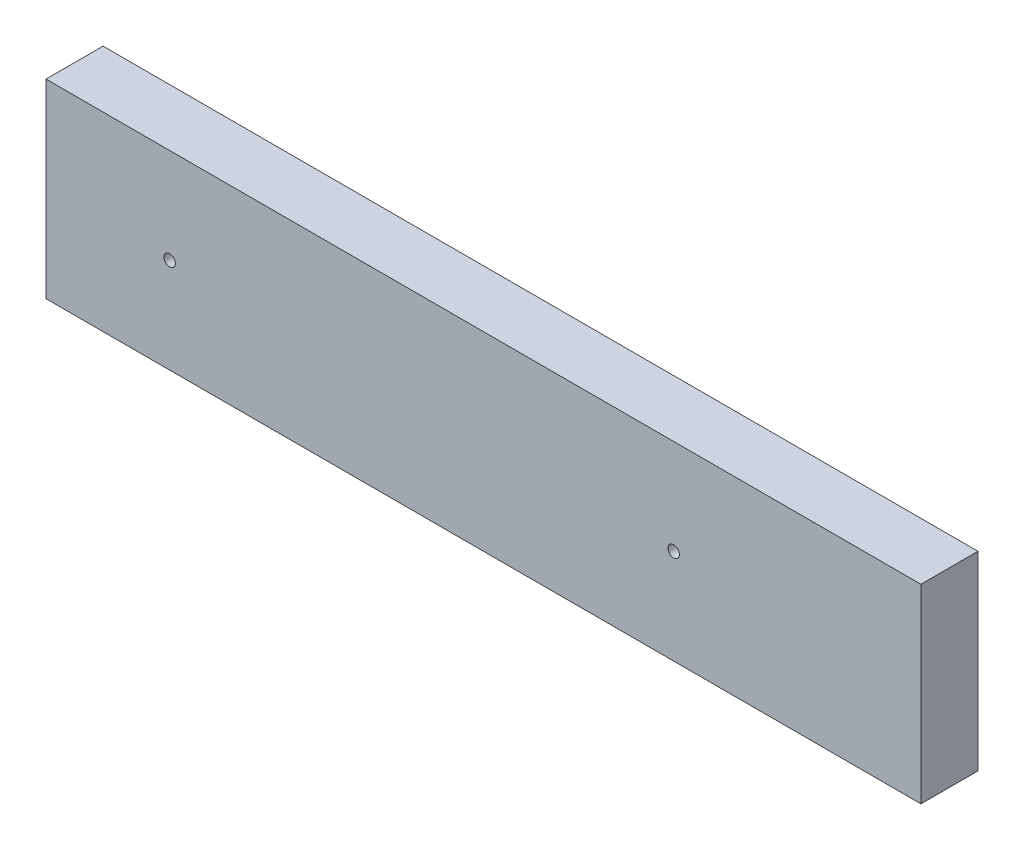
ISO-10303-21;
HEADER;
FILE_DESCRIPTION(('STEP AP214'),'2;1');
FILE_NAME('part.step','',(''),(''),'','','');
FILE_SCHEMA(('AUTOMOTIVE_DESIGN { 1 0 10303 214 1 1 1 1 }'));
ENDSEC;
DATA;
#1=APPLICATION_CONTEXT('core data for automotive mechanical design processes');
#2=APPLICATION_PROTOCOL_DEFINITION('international standard','automotive_design',2000,#1);
#3=PRODUCT_CONTEXT('',#1,'mechanical');
#4=PRODUCT('Part','Part','',(#3));
#5=PRODUCT_RELATED_PRODUCT_CATEGORY('part','',(#4));
#6=PRODUCT_DEFINITION_FORMATION('','',#4);
#7=PRODUCT_DEFINITION_CONTEXT('part definition',#1,'design');
#8=PRODUCT_DEFINITION('design','',#6,#7);
#9=PRODUCT_DEFINITION_SHAPE('','',#8);
#10=(LENGTH_UNIT() NAMED_UNIT(*) SI_UNIT(.MILLI.,.METRE.));
#11=(NAMED_UNIT(*) PLANE_ANGLE_UNIT() SI_UNIT($,.RADIAN.));
#12=(NAMED_UNIT(*) SI_UNIT($,.STERADIAN.) SOLID_ANGLE_UNIT());
#13=UNCERTAINTY_MEASURE_WITH_UNIT(LENGTH_MEASURE(1.E-05),#10,'distance_accuracy_value','');
#14=(GEOMETRIC_REPRESENTATION_CONTEXT(3) GLOBAL_UNCERTAINTY_ASSIGNED_CONTEXT((#13)) GLOBAL_UNIT_ASSIGNED_CONTEXT((#10,
#11,#12)) REPRESENTATION_CONTEXT('',''));
#15=CARTESIAN_POINT('',(0.,0.,0.));
#16=DIRECTION('',(0.,0.,1.));
#17=DIRECTION('',(1.,0.,0.));
#18=AXIS2_PLACEMENT_3D('',#15,#16,#17);
#19=CARTESIAN_POINT('',(230.,50.,30.));
#20=DIRECTION('',(-1.,0.,0.));
#21=DIRECTION('',(0.,0.,1.));
#22=AXIS2_PLACEMENT_3D('',#19,#20,#21);
#23=PLANE('',#22);
#24=DIRECTION('',(0.,1.,0.));
#25=VECTOR('',#24,1.);
#26=CARTESIAN_POINT('',(230.,50.,0.));
#27=LINE('',#26,#25);
#28=CARTESIAN_POINT('',(230.,-50.,0.));
#29=VERTEX_POINT('',#28);
#30=CARTESIAN_POINT('',(230.,50.,0.));
#31=VERTEX_POINT('',#30);
#32=EDGE_CURVE('E107',#29,#31,#27,.T.);
#33=ORIENTED_EDGE('',*,*,#32,.T.);
#34=DIRECTION('',(0.,0.,-1.));
#35=VECTOR('',#34,1.);
#36=CARTESIAN_POINT('',(230.,50.,30.));
#37=LINE('',#36,#35);
#38=CARTESIAN_POINT('',(230.,50.,30.));
#39=VERTEX_POINT('',#38);
#40=EDGE_CURVE('E11',#39,#31,#37,.T.);
#41=ORIENTED_EDGE('',*,*,#40,.F.);
#42=DIRECTION('',(0.,1.,0.));
#43=VECTOR('',#42,1.);
#44=CARTESIAN_POINT('',(230.,50.,30.));
#45=LINE('',#44,#43);
#46=CARTESIAN_POINT('',(230.,-50.,30.));
#47=VERTEX_POINT('',#46);
#48=EDGE_CURVE('E91',#47,#39,#45,.T.);
#49=ORIENTED_EDGE('',*,*,#48,.F.);
#50=DIRECTION('',(0.,0.,-1.));
#51=VECTOR('',#50,1.);
#52=CARTESIAN_POINT('',(230.,-50.,30.));
#53=LINE('',#52,#51);
#54=EDGE_CURVE('E103',#47,#29,#53,.T.);
#55=ORIENTED_EDGE('',*,*,#54,.T.);
#56=EDGE_LOOP('',(#33,#41,#49,#55));
#57=FACE_BOUND('',#56,.T.);
#58=ADVANCED_FACE('F39',(#57),#23,.F.);
#59=CARTESIAN_POINT('',(-230.,50.,30.));
#60=DIRECTION('',(0.,-1.,0.));
#61=DIRECTION('',(0.,0.,-1.));
#62=AXIS2_PLACEMENT_3D('',#59,#60,#61);
#63=PLANE('',#62);
#64=DIRECTION('',(-1.,0.,0.));
#65=VECTOR('',#64,1.);
#66=CARTESIAN_POINT('',(-230.,50.,0.));
#67=LINE('',#66,#65);
#68=CARTESIAN_POINT('',(-230.,50.,0.));
#69=VERTEX_POINT('',#68);
#70=EDGE_CURVE('E96',#31,#69,#67,.T.);
#71=ORIENTED_EDGE('',*,*,#70,.T.);
#72=DIRECTION('',(0.,0.,-1.));
#73=VECTOR('',#72,1.);
#74=CARTESIAN_POINT('',(-230.,50.,30.));
#75=LINE('',#74,#73);
#76=CARTESIAN_POINT('',(-230.,50.,30.));
#77=VERTEX_POINT('',#76);
#78=EDGE_CURVE('E48',#77,#69,#75,.T.);
#79=ORIENTED_EDGE('',*,*,#78,.F.);
#80=DIRECTION('',(-1.,0.,0.));
#81=VECTOR('',#80,1.);
#82=CARTESIAN_POINT('',(-230.,50.,30.));
#83=LINE('',#82,#81);
#84=EDGE_CURVE('E86',#39,#77,#83,.T.);
#85=ORIENTED_EDGE('',*,*,#84,.F.);
#86=ORIENTED_EDGE('',*,*,#40,.T.);
#87=EDGE_LOOP('',(#71,#79,#85,#86));
#88=FACE_BOUND('',#87,.T.);
#89=ADVANCED_FACE('F95',(#88),#63,.F.);
#90=CARTESIAN_POINT('',(-230.,50.,30.));
#91=DIRECTION('',(1.,0.,0.));
#92=DIRECTION('',(0.,0.,-1.));
#93=AXIS2_PLACEMENT_3D('',#90,#91,#92);
#94=PLANE('',#93);
#95=DIRECTION('',(0.,-1.,0.));
#96=VECTOR('',#95,1.);
#97=CARTESIAN_POINT('',(-230.,50.,0.));
#98=LINE('',#97,#96);
#99=CARTESIAN_POINT('',(-230.,-50.,0.));
#100=VERTEX_POINT('',#99);
#101=EDGE_CURVE('E73',#69,#100,#98,.T.);
#102=ORIENTED_EDGE('',*,*,#101,.T.);
#103=DIRECTION('',(0.,0.,-1.));
#104=VECTOR('',#103,1.);
#105=CARTESIAN_POINT('',(-230.,-50.,30.));
#106=LINE('',#105,#104);
#107=CARTESIAN_POINT('',(-230.,-50.,30.));
#108=VERTEX_POINT('',#107);
#109=EDGE_CURVE('E98',#108,#100,#106,.T.);
#110=ORIENTED_EDGE('',*,*,#109,.F.);
#111=DIRECTION('',(0.,-1.,0.));
#112=VECTOR('',#111,1.);
#113=CARTESIAN_POINT('',(-230.,50.,30.));
#114=LINE('',#113,#112);
#115=EDGE_CURVE('E89',#77,#108,#114,.T.);
#116=ORIENTED_EDGE('',*,*,#115,.F.);
#117=ORIENTED_EDGE('',*,*,#78,.T.);
#118=EDGE_LOOP('',(#102,#110,#116,#117));
#119=FACE_BOUND('',#118,.T.);
#120=ADVANCED_FACE('F99',(#119),#94,.F.);
#121=CARTESIAN_POINT('',(-230.,-50.,30.));
#122=DIRECTION('',(0.,1.,0.));
#123=DIRECTION('',(0.,0.,1.));
#124=AXIS2_PLACEMENT_3D('',#121,#122,#123);
#125=PLANE('',#124);
#126=DIRECTION('',(1.,0.,0.));
#127=VECTOR('',#126,1.);
#128=CARTESIAN_POINT('',(-230.,-50.,0.));
#129=LINE('',#128,#127);
#130=EDGE_CURVE('E79',#100,#29,#129,.T.);
#131=ORIENTED_EDGE('',*,*,#130,.T.);
#132=ORIENTED_EDGE('',*,*,#54,.F.);
#133=DIRECTION('',(1.,0.,0.));
#134=VECTOR('',#133,1.);
#135=CARTESIAN_POINT('',(-230.,-50.,30.));
#136=LINE('',#135,#134);
#137=EDGE_CURVE('E56',#108,#47,#136,.T.);
#138=ORIENTED_EDGE('',*,*,#137,.F.);
#139=ORIENTED_EDGE('',*,*,#109,.T.);
#140=EDGE_LOOP('',(#131,#132,#138,#139));
#141=FACE_BOUND('',#140,.T.);
#142=ADVANCED_FACE('F121',(#141),#125,.F.);
#143=CARTESIAN_POINT('',(0.,0.,30.));
#144=DIRECTION('',(0.,0.,1.));
#145=DIRECTION('',(1.,0.,0.));
#146=AXIS2_PLACEMENT_3D('',#143,#144,#145);
#147=PLANE('',#146);
#148=CARTESIAN_POINT('',(100.,0.,30.));
#149=DIRECTION('',(0.,0.,1.));
#150=DIRECTION('',(1.,0.,0.));
#151=AXIS2_PLACEMENT_3D('',#148,#149,#150);
#152=CIRCLE('',#151,3.00000000000001);
#153=CARTESIAN_POINT('',(103.,0.,30.));
#154=VERTEX_POINT('',#153);
#155=EDGE_CURVE('E111',#154,#154,#152,.T.);
#156=ORIENTED_EDGE('',*,*,#155,.F.);
#157=EDGE_LOOP('',(#156));
#158=FACE_BOUND('',#157,.T.);
#159=CARTESIAN_POINT('',(-165.,0.,30.));
#160=DIRECTION('',(0.,0.,1.));
#161=DIRECTION('',(1.,0.,0.));
#162=AXIS2_PLACEMENT_3D('',#159,#160,#161);
#163=CIRCLE('',#162,2.99999999999999);
#164=CARTESIAN_POINT('',(-162.,0.,30.));
#165=VERTEX_POINT('',#164);
#166=EDGE_CURVE('E132',#165,#165,#163,.T.);
#167=ORIENTED_EDGE('',*,*,#166,.F.);
#168=EDGE_LOOP('',(#167));
#169=FACE_BOUND('',#168,.T.);
#170=ORIENTED_EDGE('',*,*,#48,.T.);
#171=ORIENTED_EDGE('',*,*,#84,.T.);
#172=ORIENTED_EDGE('',*,*,#115,.T.);
#173=ORIENTED_EDGE('',*,*,#137,.T.);
#174=EDGE_LOOP('',(#170,#171,#172,#173));
#175=FACE_BOUND('',#174,.T.);
#176=ADVANCED_FACE('F87',(#158,#169,#175),#147,.T.);
#177=CARTESIAN_POINT('',(0.,0.,0.));
#178=DIRECTION('',(0.,0.,1.));
#179=DIRECTION('',(1.,0.,0.));
#180=AXIS2_PLACEMENT_3D('',#177,#178,#179);
#181=PLANE('',#180);
#182=CARTESIAN_POINT('',(100.,0.,0.));
#183=DIRECTION('',(0.,0.,1.));
#184=DIRECTION('',(1.,0.,0.));
#185=AXIS2_PLACEMENT_3D('',#182,#183,#184);
#186=CIRCLE('',#185,3.00000000000001);
#187=CARTESIAN_POINT('',(103.,0.,0.));
#188=VERTEX_POINT('',#187);
#189=EDGE_CURVE('E136',#188,#188,#186,.T.);
#190=ORIENTED_EDGE('',*,*,#189,.T.);
#191=EDGE_LOOP('',(#190));
#192=FACE_BOUND('',#191,.T.);
#193=CARTESIAN_POINT('',(-165.,0.,0.));
#194=DIRECTION('',(0.,0.,1.));
#195=DIRECTION('',(1.,0.,0.));
#196=AXIS2_PLACEMENT_3D('',#193,#194,#195);
#197=CIRCLE('',#196,2.99999999999999);
#198=CARTESIAN_POINT('',(-162.,0.,0.));
#199=VERTEX_POINT('',#198);
#200=EDGE_CURVE('E128',#199,#199,#197,.T.);
#201=ORIENTED_EDGE('',*,*,#200,.T.);
#202=EDGE_LOOP('',(#201));
#203=FACE_BOUND('',#202,.T.);
#204=ORIENTED_EDGE('',*,*,#32,.F.);
#205=ORIENTED_EDGE('',*,*,#130,.F.);
#206=ORIENTED_EDGE('',*,*,#101,.F.);
#207=ORIENTED_EDGE('',*,*,#70,.F.);
#208=EDGE_LOOP('',(#204,#205,#206,#207));
#209=FACE_BOUND('',#208,.T.);
#210=ADVANCED_FACE('F124',(#192,#203,#209),#181,.F.);
#211=CARTESIAN_POINT('',(-165.,0.,30.));
#212=DIRECTION('',(0.,0.,-1.));
#213=DIRECTION('',(-1.,0.,0.));
#214=AXIS2_PLACEMENT_3D('',#211,#212,#213);
#215=CYLINDRICAL_SURFACE('',#214,2.99999999999999);
#216=ORIENTED_EDGE('',*,*,#166,.T.);
#217=EDGE_LOOP('',(#216));
#218=FACE_BOUND('',#217,.T.);
#219=ORIENTED_EDGE('',*,*,#200,.F.);
#220=EDGE_LOOP('',(#219));
#221=FACE_BOUND('',#220,.T.);
#222=ADVANCED_FACE('F152',(#218,#221),#215,.F.);
#223=CARTESIAN_POINT('',(100.,0.,30.));
#224=DIRECTION('',(0.,0.,-1.));
#225=DIRECTION('',(-1.,0.,0.));
#226=AXIS2_PLACEMENT_3D('',#223,#224,#225);
#227=CYLINDRICAL_SURFACE('',#226,3.00000000000001);
#228=ORIENTED_EDGE('',*,*,#155,.T.);
#229=EDGE_LOOP('',(#228));
#230=FACE_BOUND('',#229,.T.);
#231=ORIENTED_EDGE('',*,*,#189,.F.);
#232=EDGE_LOOP('',(#231));
#233=FACE_BOUND('',#232,.T.);
#234=ADVANCED_FACE('F144',(#230,#233),#227,.F.);
#235=CLOSED_SHELL('',(#58,#89,#120,#142,#176,#210,#222,#234));
#236=MANIFOLD_SOLID_BREP('B2',#235);
#237=ADVANCED_BREP_SHAPE_REPRESENTATION('',(#18,#236),#14);
#238=SHAPE_DEFINITION_REPRESENTATION(#9,#237);
ENDSEC;
END-ISO-10303-21;
